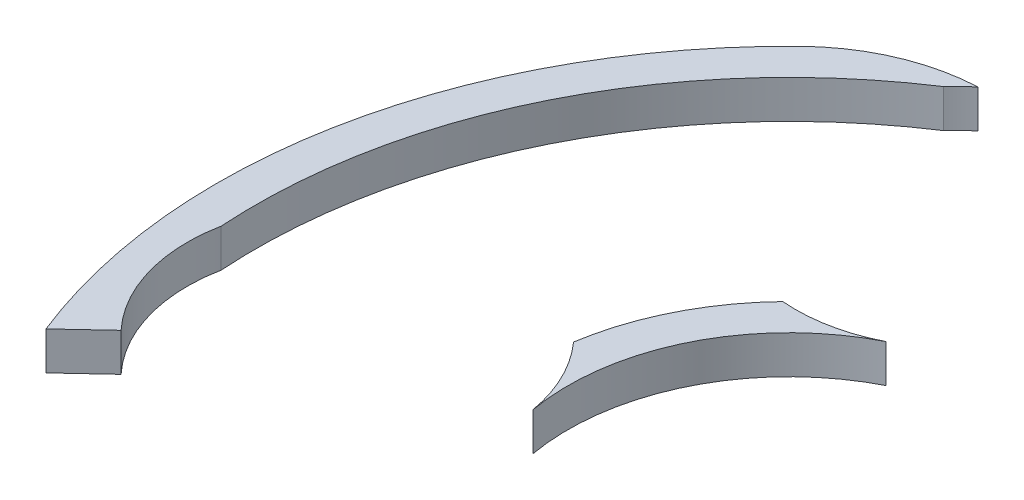
ISO-10303-21;
HEADER;
FILE_DESCRIPTION(('STEP AP214'),'2;1');
FILE_NAME('part.step','',(''),(''),'','','');
FILE_SCHEMA(('AUTOMOTIVE_DESIGN { 1 0 10303 214 1 1 1 1 }'));
ENDSEC;
DATA;
#1=APPLICATION_CONTEXT('core data for automotive mechanical design processes');
#2=APPLICATION_PROTOCOL_DEFINITION('international standard','automotive_design',2000,#1);
#3=PRODUCT_CONTEXT('',#1,'mechanical');
#4=PRODUCT('Part','Part','',(#3));
#5=PRODUCT_RELATED_PRODUCT_CATEGORY('part','',(#4));
#6=PRODUCT_DEFINITION_FORMATION('','',#4);
#7=PRODUCT_DEFINITION_CONTEXT('part definition',#1,'design');
#8=PRODUCT_DEFINITION('design','',#6,#7);
#9=PRODUCT_DEFINITION_SHAPE('','',#8);
#10=(LENGTH_UNIT() NAMED_UNIT(*) SI_UNIT(.MILLI.,.METRE.));
#11=(NAMED_UNIT(*) PLANE_ANGLE_UNIT() SI_UNIT($,.RADIAN.));
#12=(NAMED_UNIT(*) SI_UNIT($,.STERADIAN.) SOLID_ANGLE_UNIT());
#13=UNCERTAINTY_MEASURE_WITH_UNIT(LENGTH_MEASURE(1.E-05),#10,'distance_accuracy_value','');
#14=(GEOMETRIC_REPRESENTATION_CONTEXT(3) GLOBAL_UNCERTAINTY_ASSIGNED_CONTEXT((#13)) GLOBAL_UNIT_ASSIGNED_CONTEXT((#10,
#11,#12)) REPRESENTATION_CONTEXT('',''));
#15=CARTESIAN_POINT('',(0.,0.,0.));
#16=DIRECTION('',(0.,0.,1.));
#17=DIRECTION('',(1.,0.,0.));
#18=AXIS2_PLACEMENT_3D('',#15,#16,#17);
#19=CARTESIAN_POINT('',(-65.5640222322329,5.,20.1195970624359));
#20=DIRECTION('',(0.,-1.,0.));
#21=DIRECTION('',(0.,0.,-1.));
#22=AXIS2_PLACEMENT_3D('',#19,#20,#21);
#23=CYLINDRICAL_SURFACE('',#22,21.);
#24=CARTESIAN_POINT('',(-65.5640222322329,0.,20.1195970624359));
#25=DIRECTION('',(0.,1.,0.));
#26=DIRECTION('',(0.,0.,1.));
#27=AXIS2_PLACEMENT_3D('',#24,#25,#26);
#28=CIRCLE('',#27,21.);
#29=CARTESIAN_POINT('',(-44.8834254158612,0.,16.4709102687148));
#30=VERTEX_POINT('',#29);
#31=CARTESIAN_POINT('',(-49.9075799738795,0.,6.12403291479088));
#32=VERTEX_POINT('',#31);
#33=EDGE_CURVE('E110',#30,#32,#28,.T.);
#34=ORIENTED_EDGE('',*,*,#33,.F.);
#35=DIRECTION('',(0.,-1.,0.));
#36=VECTOR('',#35,1.);
#37=CARTESIAN_POINT('',(-44.8834254158612,5.,16.4709102687148));
#38=LINE('',#37,#36);
#39=CARTESIAN_POINT('',(-44.8834254158612,5.,16.4709102687148));
#40=VERTEX_POINT('',#39);
#41=EDGE_CURVE('E12',#40,#30,#38,.T.);
#42=ORIENTED_EDGE('',*,*,#41,.F.);
#43=CARTESIAN_POINT('',(-65.5640222322329,5.,20.1195970624359));
#44=DIRECTION('',(0.,1.,0.));
#45=DIRECTION('',(0.,0.,1.));
#46=AXIS2_PLACEMENT_3D('',#43,#44,#45);
#47=CIRCLE('',#46,21.);
#48=CARTESIAN_POINT('',(-49.9075799738795,5.,6.12403291479088));
#49=VERTEX_POINT('',#48);
#50=EDGE_CURVE('E103',#40,#49,#47,.T.);
#51=ORIENTED_EDGE('',*,*,#50,.T.);
#52=DIRECTION('',(0.,-1.,0.));
#53=VECTOR('',#52,1.);
#54=CARTESIAN_POINT('',(-49.9075799738795,5.,6.12403291479088));
#55=LINE('',#54,#53);
#56=EDGE_CURVE('E85',#49,#32,#55,.T.);
#57=ORIENTED_EDGE('',*,*,#56,.T.);
#58=EDGE_LOOP('',(#34,#42,#51,#57));
#59=FACE_BOUND('',#58,.T.);
#60=ADVANCED_FACE('F47',(#59),#23,.F.);
#61=CARTESIAN_POINT('',(-16.3245060027764,5.,11.4322475535761));
#62=DIRECTION('',(0.,-1.,0.));
#63=DIRECTION('',(0.,0.,-1.));
#64=AXIS2_PLACEMENT_3D('',#61,#62,#63);
#65=CYLINDRICAL_SURFACE('',#64,29.);
#66=CARTESIAN_POINT('',(-16.3245060027764,0.,11.4322475535761));
#67=DIRECTION('',(0.,1.,0.));
#68=DIRECTION('',(0.,0.,1.));
#69=AXIS2_PLACEMENT_3D('',#66,#67,#68);
#70=CIRCLE('',#69,29.);
#71=CARTESIAN_POINT('',(-29.4940320998354,0.,-14.4050042813014));
#72=VERTEX_POINT('',#71);
#73=EDGE_CURVE('E96',#72,#30,#70,.T.);
#74=ORIENTED_EDGE('',*,*,#73,.F.);
#75=DIRECTION('',(0.,-1.,0.));
#76=VECTOR('',#75,1.);
#77=CARTESIAN_POINT('',(-29.4940320998354,5.,-14.4050042813014));
#78=LINE('',#77,#76);
#79=CARTESIAN_POINT('',(-29.4940320998354,5.,-14.4050042813014));
#80=VERTEX_POINT('',#79);
#81=EDGE_CURVE('E55',#80,#72,#78,.T.);
#82=ORIENTED_EDGE('',*,*,#81,.F.);
#83=CARTESIAN_POINT('',(-16.3245060027764,5.,11.4322475535761));
#84=DIRECTION('',(0.,1.,0.));
#85=DIRECTION('',(0.,0.,1.));
#86=AXIS2_PLACEMENT_3D('',#83,#84,#85);
#87=CIRCLE('',#86,29.);
#88=EDGE_CURVE('E94',#80,#40,#87,.T.);
#89=ORIENTED_EDGE('',*,*,#88,.T.);
#90=ORIENTED_EDGE('',*,*,#41,.T.);
#91=EDGE_LOOP('',(#74,#82,#89,#90));
#92=FACE_BOUND('',#91,.T.);
#93=ADVANCED_FACE('F93',(#92),#65,.F.);
#94=CARTESIAN_POINT('',(-39.0305854804643,5.,-33.1147383686265));
#95=DIRECTION('',(0.,-1.,0.));
#96=DIRECTION('',(0.,0.,-1.));
#97=AXIS2_PLACEMENT_3D('',#94,#95,#96);
#98=CYLINDRICAL_SURFACE('',#97,21.);
#99=CARTESIAN_POINT('',(-39.0305854804643,0.,-33.1147383686265));
#100=DIRECTION('',(0.,1.,0.));
#101=DIRECTION('',(0.,0.,1.));
#102=AXIS2_PLACEMENT_3D('',#99,#100,#101);
#103=CIRCLE('',#102,21.);
#104=CARTESIAN_POINT('',(-40.7804791145299,0.,-12.187773173705));
#105=VERTEX_POINT('',#104);
#106=EDGE_CURVE('E114',#105,#72,#103,.T.);
#107=ORIENTED_EDGE('',*,*,#106,.F.);
#108=DIRECTION('',(0.,-1.,0.));
#109=VECTOR('',#108,1.);
#110=CARTESIAN_POINT('',(-40.7804791145299,5.,-12.187773173705));
#111=LINE('',#110,#109);
#112=CARTESIAN_POINT('',(-40.7804791145299,5.,-12.187773173705));
#113=VERTEX_POINT('',#112);
#114=EDGE_CURVE('E78',#113,#105,#111,.T.);
#115=ORIENTED_EDGE('',*,*,#114,.F.);
#116=CARTESIAN_POINT('',(-39.0305854804643,5.,-33.1147383686265));
#117=DIRECTION('',(0.,1.,0.));
#118=DIRECTION('',(0.,0.,1.));
#119=AXIS2_PLACEMENT_3D('',#116,#117,#118);
#120=CIRCLE('',#119,21.);
#121=EDGE_CURVE('E102',#113,#80,#120,.T.);
#122=ORIENTED_EDGE('',*,*,#121,.T.);
#123=ORIENTED_EDGE('',*,*,#81,.T.);
#124=EDGE_LOOP('',(#107,#115,#122,#123));
#125=FACE_BOUND('',#124,.T.);
#126=ADVANCED_FACE('F105',(#125),#98,.F.);
#127=CARTESIAN_POINT('',(-16.3245060027764,5.,11.4322475535761));
#128=DIRECTION('',(0.,-1.,0.));
#129=DIRECTION('',(0.,0.,-1.));
#130=AXIS2_PLACEMENT_3D('',#127,#128,#129);
#131=CYLINDRICAL_SURFACE('',#130,34.);
#132=CARTESIAN_POINT('',(-16.3245060027764,0.,11.4322475535761));
#133=DIRECTION('',(0.,1.,0.));
#134=DIRECTION('',(0.,0.,1.));
#135=AXIS2_PLACEMENT_3D('',#132,#133,#134);
#136=CIRCLE('',#135,34.);
#137=EDGE_CURVE('E116',#105,#32,#136,.T.);
#138=ORIENTED_EDGE('',*,*,#137,.T.);
#139=ORIENTED_EDGE('',*,*,#56,.F.);
#140=CARTESIAN_POINT('',(-16.3245060027764,5.,11.4322475535761));
#141=DIRECTION('',(0.,1.,0.));
#142=DIRECTION('',(0.,0.,1.));
#143=AXIS2_PLACEMENT_3D('',#140,#141,#142);
#144=CIRCLE('',#143,34.);
#145=EDGE_CURVE('E63',#113,#49,#144,.T.);
#146=ORIENTED_EDGE('',*,*,#145,.F.);
#147=ORIENTED_EDGE('',*,*,#114,.T.);
#148=EDGE_LOOP('',(#138,#139,#146,#147));
#149=FACE_BOUND('',#148,.T.);
#150=ADVANCED_FACE('F126',(#149),#131,.T.);
#151=CARTESIAN_POINT('',(0.,5.,0.));
#152=DIRECTION('',(0.,1.,0.));
#153=DIRECTION('',(0.,0.,1.));
#154=AXIS2_PLACEMENT_3D('',#151,#152,#153);
#155=PLANE('',#154);
#156=ORIENTED_EDGE('',*,*,#50,.F.);
#157=ORIENTED_EDGE('',*,*,#88,.F.);
#158=ORIENTED_EDGE('',*,*,#121,.F.);
#159=ORIENTED_EDGE('',*,*,#145,.T.);
#160=EDGE_LOOP('',(#156,#157,#158,#159));
#161=FACE_BOUND('',#160,.T.);
#162=ADVANCED_FACE('F101',(#161),#155,.T.);
#163=CARTESIAN_POINT('',(0.,0.,0.));
#164=DIRECTION('',(0.,1.,0.));
#165=DIRECTION('',(0.,0.,1.));
#166=AXIS2_PLACEMENT_3D('',#163,#164,#165);
#167=PLANE('',#166);
#168=ORIENTED_EDGE('',*,*,#33,.T.);
#169=ORIENTED_EDGE('',*,*,#137,.F.);
#170=ORIENTED_EDGE('',*,*,#106,.T.);
#171=ORIENTED_EDGE('',*,*,#73,.T.);
#172=EDGE_LOOP('',(#168,#169,#170,#171));
#173=FACE_BOUND('',#172,.T.);
#174=ADVANCED_FACE('F131',(#173),#167,.F.);
#175=CLOSED_SHELL('',(#60,#93,#126,#150,#162,#174));
#176=MANIFOLD_SOLID_BREP('B2',#175);
#177=CARTESIAN_POINT('',(-65.5640222322329,5.,20.1195970624359));
#178=DIRECTION('',(0.,-1.,0.));
#179=DIRECTION('',(0.,0.,-1.));
#180=AXIS2_PLACEMENT_3D('',#177,#178,#179);
#181=CYLINDRICAL_SURFACE('',#180,21.);
#182=CARTESIAN_POINT('',(-65.5640222322329,0.,20.1195970624359));
#183=DIRECTION('',(0.,1.,0.));
#184=DIRECTION('',(0.,0.,1.));
#185=AXIS2_PLACEMENT_3D('',#182,#183,#184);
#186=CIRCLE('',#185,21.);
#187=CARTESIAN_POINT('',(-86.1704913899171,0.,16.0731876845541));
#188=VERTEX_POINT('',#187);
#189=CARTESIAN_POINT('',(-80.9009904348254,0.,34.4645406438051));
#190=VERTEX_POINT('',#189);
#191=EDGE_CURVE('E251',#188,#190,#186,.T.);
#192=ORIENTED_EDGE('',*,*,#191,.F.);
#193=DIRECTION('',(0.,-1.,0.));
#194=VECTOR('',#193,1.);
#195=CARTESIAN_POINT('',(-86.1704913899171,5.,16.0731876845541));
#196=LINE('',#195,#194);
#197=CARTESIAN_POINT('',(-86.1704913899171,5.,16.0731876845541));
#198=VERTEX_POINT('',#197);
#199=EDGE_CURVE('E45',#198,#188,#196,.T.);
#200=ORIENTED_EDGE('',*,*,#199,.F.);
#201=CARTESIAN_POINT('',(-65.5640222322329,5.,20.1195970624359));
#202=DIRECTION('',(0.,1.,0.));
#203=DIRECTION('',(0.,0.,1.));
#204=AXIS2_PLACEMENT_3D('',#201,#202,#203);
#205=CIRCLE('',#204,21.);
#206=CARTESIAN_POINT('',(-80.9009904348254,5.,34.4645406438051));
#207=VERTEX_POINT('',#206);
#208=EDGE_CURVE('E264',#198,#207,#205,.T.);
#209=ORIENTED_EDGE('',*,*,#208,.T.);
#210=DIRECTION('',(0.,-1.,0.));
#211=VECTOR('',#210,1.);
#212=CARTESIAN_POINT('',(-80.9009904348254,5.,34.4645406438051));
#213=LINE('',#212,#211);
#214=EDGE_CURVE('E216',#207,#190,#213,.T.);
#215=ORIENTED_EDGE('',*,*,#214,.T.);
#216=EDGE_LOOP('',(#192,#200,#209,#215));
#217=FACE_BOUND('',#216,.T.);
#218=ADVANCED_FACE('F171',(#217),#181,.F.);
#219=CARTESIAN_POINT('',(-16.3245060027764,5.,11.4322475535761));
#220=DIRECTION('',(0.,-1.,0.));
#221=DIRECTION('',(0.,0.,-1.));
#222=AXIS2_PLACEMENT_3D('',#219,#220,#221);
#223=CYLINDRICAL_SURFACE('',#222,70.);
#224=CARTESIAN_POINT('',(-16.3245060027764,0.,11.4322475535761));
#225=DIRECTION('',(0.,1.,0.));
#226=DIRECTION('',(0.,0.,1.));
#227=AXIS2_PLACEMENT_3D('',#224,#225,#226);
#228=CIRCLE('',#227,70.);
#229=CARTESIAN_POINT('',(-54.6669439070955,0.,-47.1327373397322));
#230=VERTEX_POINT('',#229);
#231=EDGE_CURVE('E254',#230,#188,#228,.T.);
#232=ORIENTED_EDGE('',*,*,#231,.F.);
#233=DIRECTION('',(0.,-1.,0.));
#234=VECTOR('',#233,1.);
#235=CARTESIAN_POINT('',(-54.6669439070955,5.,-47.1327373397322));
#236=LINE('',#235,#234);
#237=CARTESIAN_POINT('',(-54.6669439070955,5.,-47.1327373397322));
#238=VERTEX_POINT('',#237);
#239=EDGE_CURVE('E179',#238,#230,#236,.T.);
#240=ORIENTED_EDGE('',*,*,#239,.F.);
#241=CARTESIAN_POINT('',(-16.3245060027764,5.,11.4322475535761));
#242=DIRECTION('',(0.,1.,0.));
#243=DIRECTION('',(0.,0.,1.));
#244=AXIS2_PLACEMENT_3D('',#241,#242,#243);
#245=CIRCLE('',#244,70.);
#246=EDGE_CURVE('E279',#238,#198,#245,.T.);
#247=ORIENTED_EDGE('',*,*,#246,.T.);
#248=ORIENTED_EDGE('',*,*,#199,.T.);
#249=EDGE_LOOP('',(#232,#240,#247,#248));
#250=FACE_BOUND('',#249,.T.);
#251=ADVANCED_FACE('F273',(#250),#223,.F.);
#252=CARTESIAN_POINT('',(-39.0305854804643,5.,-33.1147383686265));
#253=DIRECTION('',(0.,-1.,0.));
#254=DIRECTION('',(0.,0.,-1.));
#255=AXIS2_PLACEMENT_3D('',#252,#253,#254);
#256=CYLINDRICAL_SURFACE('',#255,21.);
#257=CARTESIAN_POINT('',(-39.0305854804643,0.,-33.1147383686265));
#258=DIRECTION('',(0.,1.,0.));
#259=DIRECTION('',(0.,0.,1.));
#260=AXIS2_PLACEMENT_3D('',#257,#258,#259);
#261=CIRCLE('',#260,21.);
#262=CARTESIAN_POINT('',(-52.3505116039844,0.,-49.3498721242802));
#263=VERTEX_POINT('',#262);
#264=EDGE_CURVE('E257',#263,#230,#261,.T.);
#265=ORIENTED_EDGE('',*,*,#264,.F.);
#266=DIRECTION('',(0.,-1.,0.));
#267=VECTOR('',#266,1.);
#268=CARTESIAN_POINT('',(-52.3505116039844,5.,-49.3498721242802));
#269=LINE('',#268,#267);
#270=CARTESIAN_POINT('',(-52.3505116039844,5.,-49.3498721242802));
#271=VERTEX_POINT('',#270);
#272=EDGE_CURVE('E243',#271,#263,#269,.T.);
#273=ORIENTED_EDGE('',*,*,#272,.F.);
#274=CARTESIAN_POINT('',(-39.0305854804643,5.,-33.1147383686265));
#275=DIRECTION('',(0.,1.,0.));
#276=DIRECTION('',(0.,0.,1.));
#277=AXIS2_PLACEMENT_3D('',#274,#275,#276);
#278=CIRCLE('',#277,21.);
#279=EDGE_CURVE('E236',#271,#238,#278,.T.);
#280=ORIENTED_EDGE('',*,*,#279,.T.);
#281=ORIENTED_EDGE('',*,*,#239,.T.);
#282=EDGE_LOOP('',(#265,#273,#280,#281));
#283=FACE_BOUND('',#282,.T.);
#284=ADVANCED_FACE('F270',(#283),#256,.F.);
#285=CARTESIAN_POINT('',(-51.2217062564328,5.,-24.3753691565067));
#286=DIRECTION('',(0.,-1.,0.));
#287=DIRECTION('',(0.,0.,-1.));
#288=AXIS2_PLACEMENT_3D('',#285,#286,#287);
#289=CYLINDRICAL_SURFACE('',#288,25.);
#290=CARTESIAN_POINT('',(-51.2217062564328,0.,-24.3753691565067));
#291=DIRECTION('',(0.,1.,0.));
#292=DIRECTION('',(0.,0.,1.));
#293=AXIS2_PLACEMENT_3D('',#290,#291,#292);
#294=CIRCLE('',#293,25.);
#295=CARTESIAN_POINT('',(-68.6703063832611,0.,-42.2791775115481));
#296=VERTEX_POINT('',#295);
#297=EDGE_CURVE('E242',#263,#296,#294,.T.);
#298=ORIENTED_EDGE('',*,*,#297,.T.);
#299=DIRECTION('',(0.,-1.,0.));
#300=VECTOR('',#299,1.);
#301=CARTESIAN_POINT('',(-68.6703063832611,5.,-42.2791775115481));
#302=LINE('',#301,#300);
#303=CARTESIAN_POINT('',(-68.6703063832611,5.,-42.2791775115481));
#304=VERTEX_POINT('',#303);
#305=EDGE_CURVE('E239',#304,#296,#302,.T.);
#306=ORIENTED_EDGE('',*,*,#305,.F.);
#307=CARTESIAN_POINT('',(-51.2217062564328,5.,-24.3753691565067));
#308=DIRECTION('',(0.,1.,0.));
#309=DIRECTION('',(0.,0.,1.));
#310=AXIS2_PLACEMENT_3D('',#307,#308,#309);
#311=CIRCLE('',#310,25.);
#312=EDGE_CURVE('E229',#271,#304,#311,.T.);
#313=ORIENTED_EDGE('',*,*,#312,.F.);
#314=ORIENTED_EDGE('',*,*,#272,.T.);
#315=EDGE_LOOP('',(#298,#306,#313,#314));
#316=FACE_BOUND('',#315,.T.);
#317=ADVANCED_FACE('F240',(#316),#289,.T.);
#318=CARTESIAN_POINT('',(-16.3245060027764,5.,11.4322475535761));
#319=DIRECTION('',(0.,-1.,0.));
#320=DIRECTION('',(0.,0.,-1.));
#321=AXIS2_PLACEMENT_3D('',#318,#319,#320);
#322=CYLINDRICAL_SURFACE('',#321,75.);
#323=CARTESIAN_POINT('',(-16.3245060027764,0.,11.4322475535761));
#324=DIRECTION('',(0.,1.,0.));
#325=DIRECTION('',(0.,0.,1.));
#326=AXIS2_PLACEMENT_3D('',#323,#324,#325);
#327=CIRCLE('',#326,75.);
#328=CARTESIAN_POINT('',(-85.9864254339519,0.,39.2210399196436));
#329=VERTEX_POINT('',#328);
#330=EDGE_CURVE('E209',#296,#329,#327,.T.);
#331=ORIENTED_EDGE('',*,*,#330,.T.);
#332=DIRECTION('',(0.,-1.,0.));
#333=VECTOR('',#332,1.);
#334=CARTESIAN_POINT('',(-85.9864254339519,5.,39.2210399196436));
#335=LINE('',#334,#333);
#336=CARTESIAN_POINT('',(-85.9864254339519,5.,39.2210399196436));
#337=VERTEX_POINT('',#336);
#338=EDGE_CURVE('E244',#337,#329,#335,.T.);
#339=ORIENTED_EDGE('',*,*,#338,.F.);
#340=CARTESIAN_POINT('',(-16.3245060027764,5.,11.4322475535761));
#341=DIRECTION('',(0.,1.,0.));
#342=DIRECTION('',(0.,0.,1.));
#343=AXIS2_PLACEMENT_3D('',#340,#341,#342);
#344=CIRCLE('',#343,75.);
#345=EDGE_CURVE('E233',#304,#337,#344,.T.);
#346=ORIENTED_EDGE('',*,*,#345,.F.);
#347=ORIENTED_EDGE('',*,*,#305,.T.);
#348=EDGE_LOOP('',(#331,#339,#346,#347));
#349=FACE_BOUND('',#348,.T.);
#350=ADVANCED_FACE('F246',(#349),#322,.T.);
#351=CARTESIAN_POINT('',(-20.55583507874,5.,-21.9773739221831));
#352=DIRECTION('',(-0.683092551493772,0.,-0.730331819171072));
#353=DIRECTION('',(-0.730331819171072,0.,0.683092551493772));
#354=AXIS2_PLACEMENT_3D('',#351,#352,#353);
#355=PLANE('',#354);
#356=DIRECTION('',(0.730331819171072,0.,-0.683092551493772));
#357=VECTOR('',#356,1.);
#358=CARTESIAN_POINT('',(-20.55583507874,0.,-21.9773739221831));
#359=LINE('',#358,#357);
#360=EDGE_CURVE('E262',#329,#190,#359,.T.);
#361=ORIENTED_EDGE('',*,*,#360,.T.);
#362=ORIENTED_EDGE('',*,*,#214,.F.);
#363=DIRECTION('',(0.730331819171072,0.,-0.683092551493772));
#364=VECTOR('',#363,1.);
#365=CARTESIAN_POINT('',(-20.55583507874,5.,-21.9773739221831));
#366=LINE('',#365,#364);
#367=EDGE_CURVE('E187',#337,#207,#366,.T.);
#368=ORIENTED_EDGE('',*,*,#367,.F.);
#369=ORIENTED_EDGE('',*,*,#338,.T.);
#370=EDGE_LOOP('',(#361,#362,#368,#369));
#371=FACE_BOUND('',#370,.T.);
#372=ADVANCED_FACE('F278',(#371),#355,.F.);
#373=CARTESIAN_POINT('',(0.,5.,0.));
#374=DIRECTION('',(0.,1.,0.));
#375=DIRECTION('',(0.,0.,1.));
#376=AXIS2_PLACEMENT_3D('',#373,#374,#375);
#377=PLANE('',#376);
#378=ORIENTED_EDGE('',*,*,#208,.F.);
#379=ORIENTED_EDGE('',*,*,#246,.F.);
#380=ORIENTED_EDGE('',*,*,#279,.F.);
#381=ORIENTED_EDGE('',*,*,#312,.T.);
#382=ORIENTED_EDGE('',*,*,#345,.T.);
#383=ORIENTED_EDGE('',*,*,#367,.T.);
#384=EDGE_LOOP('',(#378,#379,#380,#381,#382,#383));
#385=FACE_BOUND('',#384,.T.);
#386=ADVANCED_FACE('F231',(#385),#377,.T.);
#387=CARTESIAN_POINT('',(0.,0.,0.));
#388=DIRECTION('',(0.,1.,0.));
#389=DIRECTION('',(0.,0.,1.));
#390=AXIS2_PLACEMENT_3D('',#387,#388,#389);
#391=PLANE('',#390);
#392=ORIENTED_EDGE('',*,*,#191,.T.);
#393=ORIENTED_EDGE('',*,*,#360,.F.);
#394=ORIENTED_EDGE('',*,*,#330,.F.);
#395=ORIENTED_EDGE('',*,*,#297,.F.);
#396=ORIENTED_EDGE('',*,*,#264,.T.);
#397=ORIENTED_EDGE('',*,*,#231,.T.);
#398=EDGE_LOOP('',(#392,#393,#394,#395,#396,#397));
#399=FACE_BOUND('',#398,.T.);
#400=ADVANCED_FACE('F275',(#399),#391,.F.);
#401=CLOSED_SHELL('',(#218,#251,#284,#317,#350,#372,#386,#400));
#402=MANIFOLD_SOLID_BREP('B6_NOT_SHOWN',#401);
#403=ADVANCED_BREP_SHAPE_REPRESENTATION('',(#18,#176,#402),#14);
#404=SHAPE_DEFINITION_REPRESENTATION(#9,#403);
ENDSEC;
END-ISO-10303-21;
